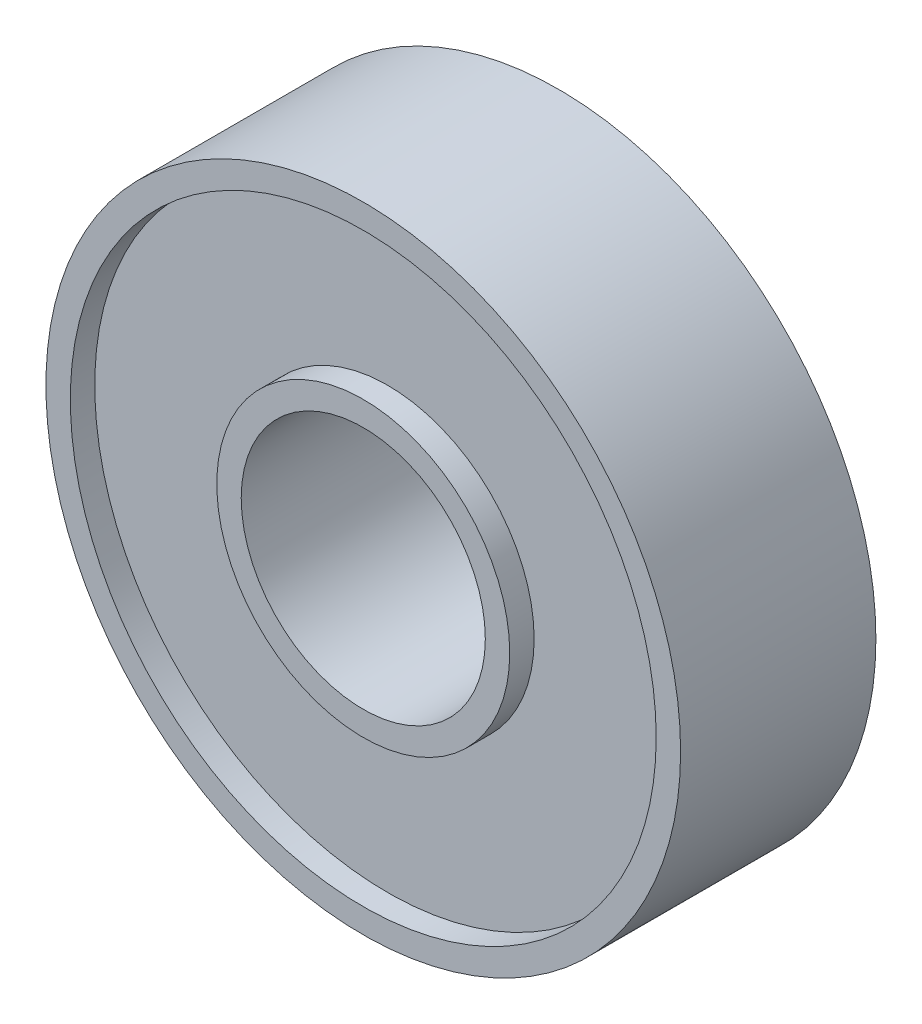
ISO-10303-21;
HEADER;
FILE_DESCRIPTION(('STEP AP214'),'2;1');
FILE_NAME('part.step','',(''),(''),'','','');
FILE_SCHEMA(('AUTOMOTIVE_DESIGN { 1 0 10303 214 1 1 1 1 }'));
ENDSEC;
DATA;
#1=APPLICATION_CONTEXT('core data for automotive mechanical design processes');
#2=APPLICATION_PROTOCOL_DEFINITION('international standard','automotive_design',2000,#1);
#3=PRODUCT_CONTEXT('',#1,'mechanical');
#4=PRODUCT('Part','Part','',(#3));
#5=PRODUCT_RELATED_PRODUCT_CATEGORY('part','',(#4));
#6=PRODUCT_DEFINITION_FORMATION('','',#4);
#7=PRODUCT_DEFINITION_CONTEXT('part definition',#1,'design');
#8=PRODUCT_DEFINITION('design','',#6,#7);
#9=PRODUCT_DEFINITION_SHAPE('','',#8);
#10=(LENGTH_UNIT() NAMED_UNIT(*) SI_UNIT(.MILLI.,.METRE.));
#11=(NAMED_UNIT(*) PLANE_ANGLE_UNIT() SI_UNIT($,.RADIAN.));
#12=(NAMED_UNIT(*) SI_UNIT($,.STERADIAN.) SOLID_ANGLE_UNIT());
#13=UNCERTAINTY_MEASURE_WITH_UNIT(LENGTH_MEASURE(1.E-05),#10,'distance_accuracy_value','');
#14=(GEOMETRIC_REPRESENTATION_CONTEXT(3) GLOBAL_UNCERTAINTY_ASSIGNED_CONTEXT((#13)) GLOBAL_UNIT_ASSIGNED_CONTEXT((#10,
#11,#12)) REPRESENTATION_CONTEXT('',''));
#15=CARTESIAN_POINT('',(0.,0.,0.));
#16=DIRECTION('',(0.,0.,1.));
#17=DIRECTION('',(1.,0.,0.));
#18=AXIS2_PLACEMENT_3D('',#15,#16,#17);
#19=CARTESIAN_POINT('',(0.,0.,0.));
#20=DIRECTION('',(0.,0.,1.));
#21=DIRECTION('',(1.,0.,0.));
#22=AXIS2_PLACEMENT_3D('',#19,#20,#21);
#23=PLANE('',#22);
#24=CARTESIAN_POINT('',(0.,0.,0.));
#25=DIRECTION('',(0.,0.,1.));
#26=DIRECTION('',(1.,0.,0.));
#27=AXIS2_PLACEMENT_3D('',#24,#25,#26);
#28=CIRCLE('',#27,2.5);
#29=CARTESIAN_POINT('',(2.5,0.,0.));
#30=VERTEX_POINT('',#29);
#31=EDGE_CURVE('E57',#30,#30,#28,.T.);
#32=ORIENTED_EDGE('',*,*,#31,.T.);
#33=EDGE_LOOP('',(#32));
#34=FACE_BOUND('',#33,.T.);
#35=CARTESIAN_POINT('',(0.,0.,0.));
#36=DIRECTION('',(0.,0.,-1.));
#37=DIRECTION('',(-1.,0.,0.));
#38=AXIS2_PLACEMENT_3D('',#35,#36,#37);
#39=CIRCLE('',#38,3.);
#40=CARTESIAN_POINT('',(-3.,0.,0.));
#41=VERTEX_POINT('',#40);
#42=EDGE_CURVE('E79',#41,#41,#39,.T.);
#43=ORIENTED_EDGE('',*,*,#42,.T.);
#44=EDGE_LOOP('',(#43));
#45=FACE_BOUND('',#44,.T.);
#46=ADVANCED_FACE('F43',(#34,#45),#23,.F.);
#47=CARTESIAN_POINT('',(0.,0.,4.));
#48=DIRECTION('',(0.,0.,1.));
#49=DIRECTION('',(1.,0.,0.));
#50=AXIS2_PLACEMENT_3D('',#47,#48,#49);
#51=PLANE('',#50);
#52=CARTESIAN_POINT('',(0.,0.,4.));
#53=DIRECTION('',(0.,0.,1.));
#54=DIRECTION('',(1.,0.,0.));
#55=AXIS2_PLACEMENT_3D('',#52,#53,#54);
#56=CIRCLE('',#55,2.5);
#57=CARTESIAN_POINT('',(2.5,0.,4.));
#58=VERTEX_POINT('',#57);
#59=EDGE_CURVE('E53',#58,#58,#56,.T.);
#60=ORIENTED_EDGE('',*,*,#59,.F.);
#61=EDGE_LOOP('',(#60));
#62=FACE_BOUND('',#61,.T.);
#63=CARTESIAN_POINT('',(0.,0.,4.));
#64=DIRECTION('',(0.,0.,1.));
#65=DIRECTION('',(1.,0.,0.));
#66=AXIS2_PLACEMENT_3D('',#63,#64,#65);
#67=CIRCLE('',#66,3.);
#68=CARTESIAN_POINT('',(3.,0.,4.));
#69=VERTEX_POINT('',#68);
#70=EDGE_CURVE('E70',#69,#69,#67,.T.);
#71=ORIENTED_EDGE('',*,*,#70,.T.);
#72=EDGE_LOOP('',(#71));
#73=FACE_BOUND('',#72,.T.);
#74=ADVANCED_FACE('F118',(#62,#73),#51,.T.);
#75=CARTESIAN_POINT('',(0.,0.,4.));
#76=DIRECTION('',(0.,0.,1.));
#77=DIRECTION('',(1.,0.,0.));
#78=AXIS2_PLACEMENT_3D('',#75,#76,#77);
#79=CIRCLE('',#78,6.);
#80=CARTESIAN_POINT('',(6.,0.,4.));
#81=VERTEX_POINT('',#80);
#82=EDGE_CURVE('E65',#81,#81,#79,.T.);
#83=ORIENTED_EDGE('',*,*,#82,.F.);
#84=EDGE_LOOP('',(#83));
#85=FACE_BOUND('',#84,.T.);
#86=CARTESIAN_POINT('',(0.,0.,4.));
#87=DIRECTION('',(0.,0.,1.));
#88=DIRECTION('',(1.,0.,0.));
#89=AXIS2_PLACEMENT_3D('',#86,#87,#88);
#90=CIRCLE('',#89,6.5);
#91=CARTESIAN_POINT('',(6.5,0.,4.));
#92=VERTEX_POINT('',#91);
#93=EDGE_CURVE('E11',#92,#92,#90,.T.);
#94=ORIENTED_EDGE('',*,*,#93,.T.);
#95=EDGE_LOOP('',(#94));
#96=FACE_BOUND('',#95,.T.);
#97=ADVANCED_FACE('F104',(#85,#96),#51,.T.);
#98=CARTESIAN_POINT('',(0.,0.,0.));
#99=DIRECTION('',(0.,0.,-1.));
#100=DIRECTION('',(-1.,0.,0.));
#101=AXIS2_PLACEMENT_3D('',#98,#99,#100);
#102=CIRCLE('',#101,6.);
#103=CARTESIAN_POINT('',(-6.,0.,0.));
#104=VERTEX_POINT('',#103);
#105=EDGE_CURVE('E75',#104,#104,#102,.T.);
#106=ORIENTED_EDGE('',*,*,#105,.F.);
#107=EDGE_LOOP('',(#106));
#108=FACE_BOUND('',#107,.T.);
#109=CARTESIAN_POINT('',(0.,0.,0.));
#110=DIRECTION('',(0.,0.,1.));
#111=DIRECTION('',(1.,0.,0.));
#112=AXIS2_PLACEMENT_3D('',#109,#110,#111);
#113=CIRCLE('',#112,6.5);
#114=CARTESIAN_POINT('',(6.5,0.,0.));
#115=VERTEX_POINT('',#114);
#116=EDGE_CURVE('E50',#115,#115,#113,.T.);
#117=ORIENTED_EDGE('',*,*,#116,.F.);
#118=EDGE_LOOP('',(#117));
#119=FACE_BOUND('',#118,.T.);
#120=ADVANCED_FACE('F105',(#108,#119),#23,.F.);
#121=CARTESIAN_POINT('',(0.,0.,4.));
#122=DIRECTION('',(0.,0.,-1.));
#123=DIRECTION('',(-1.,0.,0.));
#124=AXIS2_PLACEMENT_3D('',#121,#122,#123);
#125=CYLINDRICAL_SURFACE('',#124,6.5);
#126=ORIENTED_EDGE('',*,*,#93,.F.);
#127=EDGE_LOOP('',(#126));
#128=FACE_BOUND('',#127,.T.);
#129=ORIENTED_EDGE('',*,*,#116,.T.);
#130=EDGE_LOOP('',(#129));
#131=FACE_BOUND('',#130,.T.);
#132=ADVANCED_FACE('F44',(#128,#131),#125,.T.);
#133=CARTESIAN_POINT('',(0.,0.,4.));
#134=DIRECTION('',(0.,0.,-1.));
#135=DIRECTION('',(-1.,0.,0.));
#136=AXIS2_PLACEMENT_3D('',#133,#134,#135);
#137=CYLINDRICAL_SURFACE('',#136,2.5);
#138=ORIENTED_EDGE('',*,*,#59,.T.);
#139=EDGE_LOOP('',(#138));
#140=FACE_BOUND('',#139,.T.);
#141=ORIENTED_EDGE('',*,*,#31,.F.);
#142=EDGE_LOOP('',(#141));
#143=FACE_BOUND('',#142,.T.);
#144=ADVANCED_FACE('F110',(#140,#143),#137,.F.);
#145=CARTESIAN_POINT('',(0.,0.,3.5));
#146=DIRECTION('',(0.,0.,1.));
#147=DIRECTION('',(1.,0.,0.));
#148=AXIS2_PLACEMENT_3D('',#145,#146,#147);
#149=CYLINDRICAL_SURFACE('',#148,6.);
#150=CARTESIAN_POINT('',(0.,0.,3.5));
#151=DIRECTION('',(0.,0.,1.));
#152=DIRECTION('',(1.,0.,0.));
#153=AXIS2_PLACEMENT_3D('',#150,#151,#152);
#154=CIRCLE('',#153,6.);
#155=CARTESIAN_POINT('',(6.,0.,3.5));
#156=VERTEX_POINT('',#155);
#157=EDGE_CURVE('E56',#156,#156,#154,.T.);
#158=ORIENTED_EDGE('',*,*,#157,.F.);
#159=EDGE_LOOP('',(#158));
#160=FACE_BOUND('',#159,.T.);
#161=ORIENTED_EDGE('',*,*,#82,.T.);
#162=EDGE_LOOP('',(#161));
#163=FACE_BOUND('',#162,.T.);
#164=ADVANCED_FACE('F114',(#160,#163),#149,.F.);
#165=CARTESIAN_POINT('',(0.,0.,3.5));
#166=DIRECTION('',(0.,0.,1.));
#167=DIRECTION('',(1.,0.,0.));
#168=AXIS2_PLACEMENT_3D('',#165,#166,#167);
#169=PLANE('',#168);
#170=CARTESIAN_POINT('',(0.,0.,3.5));
#171=DIRECTION('',(0.,0.,1.));
#172=DIRECTION('',(1.,0.,0.));
#173=AXIS2_PLACEMENT_3D('',#170,#171,#172);
#174=CIRCLE('',#173,3.);
#175=CARTESIAN_POINT('',(3.,0.,3.5));
#176=VERTEX_POINT('',#175);
#177=EDGE_CURVE('E63',#176,#176,#174,.T.);
#178=ORIENTED_EDGE('',*,*,#177,.F.);
#179=EDGE_LOOP('',(#178));
#180=FACE_BOUND('',#179,.T.);
#181=ORIENTED_EDGE('',*,*,#157,.T.);
#182=EDGE_LOOP('',(#181));
#183=FACE_BOUND('',#182,.T.);
#184=ADVANCED_FACE('F135',(#180,#183),#169,.T.);
#185=CARTESIAN_POINT('',(0.,0.,3.5));
#186=DIRECTION('',(0.,0.,1.));
#187=DIRECTION('',(1.,0.,0.));
#188=AXIS2_PLACEMENT_3D('',#185,#186,#187);
#189=CYLINDRICAL_SURFACE('',#188,3.);
#190=ORIENTED_EDGE('',*,*,#177,.T.);
#191=EDGE_LOOP('',(#190));
#192=FACE_BOUND('',#191,.T.);
#193=ORIENTED_EDGE('',*,*,#70,.F.);
#194=EDGE_LOOP('',(#193));
#195=FACE_BOUND('',#194,.T.);
#196=ADVANCED_FACE('F97',(#192,#195),#189,.T.);
#197=CARTESIAN_POINT('',(0.,0.,0.5));
#198=DIRECTION('',(0.,0.,-1.));
#199=DIRECTION('',(-1.,0.,0.));
#200=AXIS2_PLACEMENT_3D('',#197,#198,#199);
#201=CYLINDRICAL_SURFACE('',#200,6.);
#202=CARTESIAN_POINT('',(0.,0.,0.5));
#203=DIRECTION('',(0.,0.,-1.));
#204=DIRECTION('',(-1.,0.,0.));
#205=AXIS2_PLACEMENT_3D('',#202,#203,#204);
#206=CIRCLE('',#205,6.);
#207=CARTESIAN_POINT('',(-6.,0.,0.5));
#208=VERTEX_POINT('',#207);
#209=EDGE_CURVE('E73',#208,#208,#206,.T.);
#210=ORIENTED_EDGE('',*,*,#209,.F.);
#211=EDGE_LOOP('',(#210));
#212=FACE_BOUND('',#211,.T.);
#213=ORIENTED_EDGE('',*,*,#105,.T.);
#214=EDGE_LOOP('',(#213));
#215=FACE_BOUND('',#214,.T.);
#216=ADVANCED_FACE('F91',(#212,#215),#201,.F.);
#217=CARTESIAN_POINT('',(0.,0.,0.5));
#218=DIRECTION('',(0.,0.,-1.));
#219=DIRECTION('',(-1.,0.,0.));
#220=AXIS2_PLACEMENT_3D('',#217,#218,#219);
#221=PLANE('',#220);
#222=CARTESIAN_POINT('',(0.,0.,0.5));
#223=DIRECTION('',(0.,0.,-1.));
#224=DIRECTION('',(-1.,0.,0.));
#225=AXIS2_PLACEMENT_3D('',#222,#223,#224);
#226=CIRCLE('',#225,3.);
#227=CARTESIAN_POINT('',(-3.,0.,0.5));
#228=VERTEX_POINT('',#227);
#229=EDGE_CURVE('E80',#228,#228,#226,.T.);
#230=ORIENTED_EDGE('',*,*,#229,.F.);
#231=EDGE_LOOP('',(#230));
#232=FACE_BOUND('',#231,.T.);
#233=ORIENTED_EDGE('',*,*,#209,.T.);
#234=EDGE_LOOP('',(#233));
#235=FACE_BOUND('',#234,.T.);
#236=ADVANCED_FACE('F86',(#232,#235),#221,.T.);
#237=CARTESIAN_POINT('',(0.,0.,0.5));
#238=DIRECTION('',(0.,0.,-1.));
#239=DIRECTION('',(-1.,0.,0.));
#240=AXIS2_PLACEMENT_3D('',#237,#238,#239);
#241=CYLINDRICAL_SURFACE('',#240,3.);
#242=ORIENTED_EDGE('',*,*,#229,.T.);
#243=EDGE_LOOP('',(#242));
#244=FACE_BOUND('',#243,.T.);
#245=ORIENTED_EDGE('',*,*,#42,.F.);
#246=EDGE_LOOP('',(#245));
#247=FACE_BOUND('',#246,.T.);
#248=ADVANCED_FACE('F87',(#244,#247),#241,.T.);
#249=CLOSED_SHELL('',(#46,#74,#97,#120,#132,#144,#164,#184,#196,#216,#236,#248));
#250=MANIFOLD_SOLID_BREP('B2',#249);
#251=ADVANCED_BREP_SHAPE_REPRESENTATION('',(#18,#250),#14);
#252=SHAPE_DEFINITION_REPRESENTATION(#9,#251);
ENDSEC;
END-ISO-10303-21;
